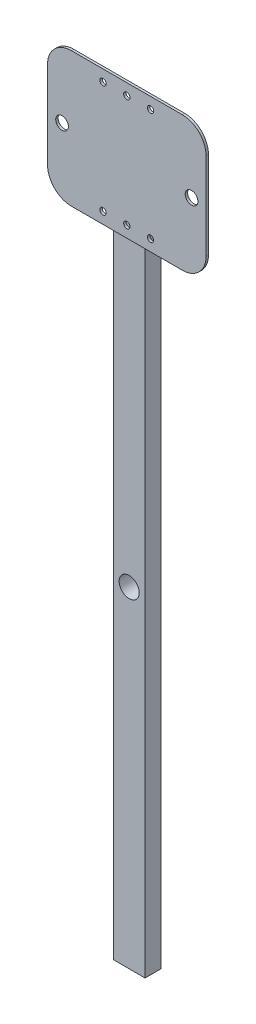
ISO-10303-21;
HEADER;
FILE_DESCRIPTION(('STEP AP214'),'2;1');
FILE_NAME('part.step','',(''),(''),'','','');
FILE_SCHEMA(('AUTOMOTIVE_DESIGN { 1 0 10303 214 1 1 1 1 }'));
ENDSEC;
DATA;
#1=APPLICATION_CONTEXT('core data for automotive mechanical design processes');
#2=APPLICATION_PROTOCOL_DEFINITION('international standard','automotive_design',2000,#1);
#3=PRODUCT_CONTEXT('',#1,'mechanical');
#4=PRODUCT('Part','Part','',(#3));
#5=PRODUCT_RELATED_PRODUCT_CATEGORY('part','',(#4));
#6=PRODUCT_DEFINITION_FORMATION('','',#4);
#7=PRODUCT_DEFINITION_CONTEXT('part definition',#1,'design');
#8=PRODUCT_DEFINITION('design','',#6,#7);
#9=PRODUCT_DEFINITION_SHAPE('','',#8);
#10=(LENGTH_UNIT() NAMED_UNIT(*) SI_UNIT(.MILLI.,.METRE.));
#11=(NAMED_UNIT(*) PLANE_ANGLE_UNIT() SI_UNIT($,.RADIAN.));
#12=(NAMED_UNIT(*) SI_UNIT($,.STERADIAN.) SOLID_ANGLE_UNIT());
#13=UNCERTAINTY_MEASURE_WITH_UNIT(LENGTH_MEASURE(1.E-05),#10,'distance_accuracy_value','');
#14=(GEOMETRIC_REPRESENTATION_CONTEXT(3) GLOBAL_UNCERTAINTY_ASSIGNED_CONTEXT((#13)) GLOBAL_UNIT_ASSIGNED_CONTEXT((#10,
#11,#12)) REPRESENTATION_CONTEXT('',''));
#15=CARTESIAN_POINT('',(0.,0.,0.));
#16=DIRECTION('',(0.,0.,1.));
#17=DIRECTION('',(1.,0.,0.));
#18=AXIS2_PLACEMENT_3D('',#15,#16,#17);
#19=CARTESIAN_POINT('',(-70.,-55.,3.));
#20=DIRECTION('',(0.,0.,1.));
#21=DIRECTION('',(1.,0.,0.));
#22=AXIS2_PLACEMENT_3D('',#19,#20,#21);
#23=PLANE('',#22);
#24=CARTESIAN_POINT('',(-30.,-70.6,3.));
#25=DIRECTION('',(0.,0.,1.));
#26=DIRECTION('',(1.,0.,0.));
#27=AXIS2_PLACEMENT_3D('',#24,#25,#26);
#28=CIRCLE('',#27,4.);
#29=CARTESIAN_POINT('',(-26.,-70.6,3.));
#30=VERTEX_POINT('',#29);
#31=EDGE_CURVE('E225',#30,#30,#28,.T.);
#32=ORIENTED_EDGE('',*,*,#31,.F.);
#33=EDGE_LOOP('',(#32));
#34=FACE_BOUND('',#33,.T.);
#35=CARTESIAN_POINT('',(-30.,70.6,3.));
#36=DIRECTION('',(0.,0.,1.));
#37=DIRECTION('',(1.,0.,0.));
#38=AXIS2_PLACEMENT_3D('',#35,#36,#37);
#39=CIRCLE('',#38,4.);
#40=CARTESIAN_POINT('',(-26.,70.6,3.));
#41=VERTEX_POINT('',#40);
#42=EDGE_CURVE('E237',#41,#41,#39,.T.);
#43=ORIENTED_EDGE('',*,*,#42,.F.);
#44=EDGE_LOOP('',(#43));
#45=FACE_BOUND('',#44,.T.);
#46=CARTESIAN_POINT('',(0.,70.6,3.));
#47=DIRECTION('',(0.,0.,1.));
#48=DIRECTION('',(1.,0.,0.));
#49=AXIS2_PLACEMENT_3D('',#46,#47,#48);
#50=CIRCLE('',#49,4.);
#51=CARTESIAN_POINT('',(4.,70.6,3.));
#52=VERTEX_POINT('',#51);
#53=EDGE_CURVE('E249',#52,#52,#50,.T.);
#54=ORIENTED_EDGE('',*,*,#53,.F.);
#55=EDGE_LOOP('',(#54));
#56=FACE_BOUND('',#55,.T.);
#57=CARTESIAN_POINT('',(-81.705,0.,3.));
#58=DIRECTION('',(0.,0.,1.));
#59=DIRECTION('',(1.,0.,0.));
#60=AXIS2_PLACEMENT_3D('',#57,#58,#59);
#61=CIRCLE('',#60,8.);
#62=CARTESIAN_POINT('',(-73.705,0.,3.));
#63=VERTEX_POINT('',#62);
#64=EDGE_CURVE('E149',#63,#63,#61,.T.);
#65=ORIENTED_EDGE('',*,*,#64,.F.);
#66=EDGE_LOOP('',(#65));
#67=FACE_BOUND('',#66,.T.);
#68=CARTESIAN_POINT('',(-70.,-55.,3.));
#69=DIRECTION('',(0.,0.,1.));
#70=DIRECTION('',(1.,0.,0.));
#71=AXIS2_PLACEMENT_3D('',#68,#69,#70);
#72=CIRCLE('',#71,30.);
#73=CARTESIAN_POINT('',(-99.9999999999999,-54.9999999999998,3.));
#74=VERTEX_POINT('',#73);
#75=CARTESIAN_POINT('',(-69.9999999999997,-85.,3.));
#76=VERTEX_POINT('',#75);
#77=EDGE_CURVE('E164',#74,#76,#72,.T.);
#78=ORIENTED_EDGE('',*,*,#77,.T.);
#79=DIRECTION('',(1.,0.,0.));
#80=VECTOR('',#79,1.);
#81=CARTESIAN_POINT('',(69.9999999999998,-85.,3.));
#82=LINE('',#81,#80);
#83=CARTESIAN_POINT('',(69.9999999999998,-85.,3.));
#84=VERTEX_POINT('',#83);
#85=EDGE_CURVE('E102',#76,#84,#82,.T.);
#86=ORIENTED_EDGE('',*,*,#85,.T.);
#87=CARTESIAN_POINT('',(70.,-55.,3.));
#88=DIRECTION('',(0.,0.,1.));
#89=DIRECTION('',(1.,0.,0.));
#90=AXIS2_PLACEMENT_3D('',#87,#88,#89);
#91=CIRCLE('',#90,30.);
#92=CARTESIAN_POINT('',(100.,-54.9999999999998,3.));
#93=VERTEX_POINT('',#92);
#94=EDGE_CURVE('E267',#84,#93,#91,.T.);
#95=ORIENTED_EDGE('',*,*,#94,.T.);
#96=DIRECTION('',(0.,1.,0.));
#97=VECTOR('',#96,1.);
#98=CARTESIAN_POINT('',(100.,54.9999999999998,3.));
#99=LINE('',#98,#97);
#100=CARTESIAN_POINT('',(100.,54.9999999999998,3.));
#101=VERTEX_POINT('',#100);
#102=EDGE_CURVE('E269',#93,#101,#99,.T.);
#103=ORIENTED_EDGE('',*,*,#102,.T.);
#104=CARTESIAN_POINT('',(70.,55.,3.));
#105=DIRECTION('',(0.,0.,1.));
#106=DIRECTION('',(1.,0.,0.));
#107=AXIS2_PLACEMENT_3D('',#104,#105,#106);
#108=CIRCLE('',#107,30.);
#109=CARTESIAN_POINT('',(69.9999999999998,85.,3.));
#110=VERTEX_POINT('',#109);
#111=EDGE_CURVE('E124',#101,#110,#108,.T.);
#112=ORIENTED_EDGE('',*,*,#111,.T.);
#113=DIRECTION('',(-1.,0.,0.));
#114=VECTOR('',#113,1.);
#115=CARTESIAN_POINT('',(69.9999999999998,85.,3.));
#116=LINE('',#115,#114);
#117=CARTESIAN_POINT('',(-69.9999999999998,85.,3.));
#118=VERTEX_POINT('',#117);
#119=EDGE_CURVE('E117',#110,#118,#116,.T.);
#120=ORIENTED_EDGE('',*,*,#119,.T.);
#121=CARTESIAN_POINT('',(-70.,55.,3.));
#122=DIRECTION('',(0.,0.,1.));
#123=DIRECTION('',(1.,0.,0.));
#124=AXIS2_PLACEMENT_3D('',#121,#122,#123);
#125=CIRCLE('',#124,30.);
#126=CARTESIAN_POINT('',(-100.,54.9999999999998,3.));
#127=VERTEX_POINT('',#126);
#128=EDGE_CURVE('E121',#118,#127,#125,.T.);
#129=ORIENTED_EDGE('',*,*,#128,.T.);
#130=DIRECTION('',(0.,-1.,0.));
#131=VECTOR('',#130,1.);
#132=CARTESIAN_POINT('',(-100.,54.9999999999998,3.));
#133=LINE('',#132,#131);
#134=EDGE_CURVE('E60',#127,#74,#133,.T.);
#135=ORIENTED_EDGE('',*,*,#134,.T.);
#136=EDGE_LOOP('',(#78,#86,#95,#103,#112,#120,#129,#135));
#137=FACE_BOUND('',#136,.T.);
#138=CARTESIAN_POINT('',(81.705,0.,3.));
#139=DIRECTION('',(0.,0.,1.));
#140=DIRECTION('',(1.,0.,0.));
#141=AXIS2_PLACEMENT_3D('',#138,#139,#140);
#142=CIRCLE('',#141,8.);
#143=CARTESIAN_POINT('',(89.705,0.,3.));
#144=VERTEX_POINT('',#143);
#145=EDGE_CURVE('E255',#144,#144,#142,.T.);
#146=ORIENTED_EDGE('',*,*,#145,.F.);
#147=EDGE_LOOP('',(#146));
#148=FACE_BOUND('',#147,.T.);
#149=CARTESIAN_POINT('',(0.,-70.6,3.));
#150=DIRECTION('',(0.,0.,1.));
#151=DIRECTION('',(1.,0.,0.));
#152=AXIS2_PLACEMENT_3D('',#149,#150,#151);
#153=CIRCLE('',#152,4.);
#154=CARTESIAN_POINT('',(4.,-70.6,3.));
#155=VERTEX_POINT('',#154);
#156=EDGE_CURVE('E243',#155,#155,#153,.T.);
#157=ORIENTED_EDGE('',*,*,#156,.F.);
#158=EDGE_LOOP('',(#157));
#159=FACE_BOUND('',#158,.T.);
#160=CARTESIAN_POINT('',(30.,70.6,3.));
#161=DIRECTION('',(0.,0.,1.));
#162=DIRECTION('',(1.,0.,0.));
#163=AXIS2_PLACEMENT_3D('',#160,#161,#162);
#164=CIRCLE('',#163,4.);
#165=CARTESIAN_POINT('',(34.,70.6,3.));
#166=VERTEX_POINT('',#165);
#167=EDGE_CURVE('E231',#166,#166,#164,.T.);
#168=ORIENTED_EDGE('',*,*,#167,.F.);
#169=EDGE_LOOP('',(#168));
#170=FACE_BOUND('',#169,.T.);
#171=CARTESIAN_POINT('',(30.,-70.6,3.));
#172=DIRECTION('',(0.,0.,1.));
#173=DIRECTION('',(1.,0.,0.));
#174=AXIS2_PLACEMENT_3D('',#171,#172,#173);
#175=CIRCLE('',#174,4.);
#176=CARTESIAN_POINT('',(34.,-70.6,3.));
#177=VERTEX_POINT('',#176);
#178=EDGE_CURVE('E219',#177,#177,#175,.T.);
#179=ORIENTED_EDGE('',*,*,#178,.F.);
#180=EDGE_LOOP('',(#179));
#181=FACE_BOUND('',#180,.T.);
#182=ADVANCED_FACE('F34',(#34,#45,#56,#67,#137,#148,#159,#170,#181),#23,.T.);
#183=CARTESIAN_POINT('',(-70.,-55.,0.));
#184=DIRECTION('',(0.,0.,1.));
#185=DIRECTION('',(1.,0.,0.));
#186=AXIS2_PLACEMENT_3D('',#183,#184,#185);
#187=PLANE('',#186);
#188=DIRECTION('',(-1.,0.,0.));
#189=VECTOR('',#188,1.);
#190=CARTESIAN_POINT('',(-20.,0.,0.));
#191=LINE('',#190,#189);
#192=CARTESIAN_POINT('',(20.,0.,0.));
#193=VERTEX_POINT('',#192);
#194=CARTESIAN_POINT('',(-20.,0.,0.));
#195=VERTEX_POINT('',#194);
#196=EDGE_CURVE('E190',#193,#195,#191,.T.);
#197=ORIENTED_EDGE('',*,*,#196,.T.);
#198=DIRECTION('',(0.,-1.,0.));
#199=VECTOR('',#198,1.);
#200=CARTESIAN_POINT('',(-20.,0.,0.));
#201=LINE('',#200,#199);
#202=CARTESIAN_POINT('',(-20.,-85.,0.));
#203=VERTEX_POINT('',#202);
#204=EDGE_CURVE('E51',#195,#203,#201,.T.);
#205=ORIENTED_EDGE('',*,*,#204,.T.);
#206=DIRECTION('',(1.,0.,0.));
#207=VECTOR('',#206,1.);
#208=CARTESIAN_POINT('',(69.9999999999998,-85.,0.));
#209=LINE('',#208,#207);
#210=CARTESIAN_POINT('',(-69.9999999999997,-85.,0.));
#211=VERTEX_POINT('',#210);
#212=EDGE_CURVE('E150',#211,#203,#209,.T.);
#213=ORIENTED_EDGE('',*,*,#212,.F.);
#214=CARTESIAN_POINT('',(-70.,-55.,0.));
#215=DIRECTION('',(0.,0.,1.));
#216=DIRECTION('',(1.,0.,0.));
#217=AXIS2_PLACEMENT_3D('',#214,#215,#216);
#218=CIRCLE('',#217,30.);
#219=CARTESIAN_POINT('',(-99.9999999999999,-54.9999999999998,0.));
#220=VERTEX_POINT('',#219);
#221=EDGE_CURVE('E145',#220,#211,#218,.T.);
#222=ORIENTED_EDGE('',*,*,#221,.F.);
#223=DIRECTION('',(0.,-1.,0.));
#224=VECTOR('',#223,1.);
#225=CARTESIAN_POINT('',(-100.,54.9999999999998,0.));
#226=LINE('',#225,#224);
#227=CARTESIAN_POINT('',(-100.,54.9999999999998,0.));
#228=VERTEX_POINT('',#227);
#229=EDGE_CURVE('E93',#228,#220,#226,.T.);
#230=ORIENTED_EDGE('',*,*,#229,.F.);
#231=CARTESIAN_POINT('',(-70.,55.,0.));
#232=DIRECTION('',(0.,0.,1.));
#233=DIRECTION('',(1.,0.,0.));
#234=AXIS2_PLACEMENT_3D('',#231,#232,#233);
#235=CIRCLE('',#234,30.);
#236=CARTESIAN_POINT('',(-69.9999999999998,85.,0.));
#237=VERTEX_POINT('',#236);
#238=EDGE_CURVE('E161',#237,#228,#235,.T.);
#239=ORIENTED_EDGE('',*,*,#238,.F.);
#240=DIRECTION('',(-1.,0.,0.));
#241=VECTOR('',#240,1.);
#242=CARTESIAN_POINT('',(69.9999999999998,85.,0.));
#243=LINE('',#242,#241);
#244=CARTESIAN_POINT('',(69.9999999999998,85.,0.));
#245=VERTEX_POINT('',#244);
#246=EDGE_CURVE('E133',#245,#237,#243,.T.);
#247=ORIENTED_EDGE('',*,*,#246,.F.);
#248=CARTESIAN_POINT('',(70.,55.,0.));
#249=DIRECTION('',(0.,0.,1.));
#250=DIRECTION('',(1.,0.,0.));
#251=AXIS2_PLACEMENT_3D('',#248,#249,#250);
#252=CIRCLE('',#251,30.);
#253=CARTESIAN_POINT('',(100.,54.9999999999998,0.));
#254=VERTEX_POINT('',#253);
#255=EDGE_CURVE('E158',#254,#245,#252,.T.);
#256=ORIENTED_EDGE('',*,*,#255,.F.);
#257=DIRECTION('',(0.,1.,0.));
#258=VECTOR('',#257,1.);
#259=CARTESIAN_POINT('',(100.,54.9999999999998,0.));
#260=LINE('',#259,#258);
#261=CARTESIAN_POINT('',(100.,-54.9999999999998,0.));
#262=VERTEX_POINT('',#261);
#263=EDGE_CURVE('E156',#262,#254,#260,.T.);
#264=ORIENTED_EDGE('',*,*,#263,.F.);
#265=CARTESIAN_POINT('',(70.,-55.,0.));
#266=DIRECTION('',(0.,0.,1.));
#267=DIRECTION('',(1.,0.,0.));
#268=AXIS2_PLACEMENT_3D('',#265,#266,#267);
#269=CIRCLE('',#268,30.);
#270=CARTESIAN_POINT('',(69.9999999999998,-85.,0.));
#271=VERTEX_POINT('',#270);
#272=EDGE_CURVE('E153',#271,#262,#269,.T.);
#273=ORIENTED_EDGE('',*,*,#272,.F.);
#274=CARTESIAN_POINT('',(20.,-85.,0.));
#275=VERTEX_POINT('',#274);
#276=EDGE_CURVE('E148',#275,#271,#209,.T.);
#277=ORIENTED_EDGE('',*,*,#276,.F.);
#278=DIRECTION('',(0.,1.,0.));
#279=VECTOR('',#278,1.);
#280=CARTESIAN_POINT('',(20.,0.,0.));
#281=LINE('',#280,#279);
#282=EDGE_CURVE('E11',#275,#193,#281,.T.);
#283=ORIENTED_EDGE('',*,*,#282,.T.);
#284=EDGE_LOOP('',(#197,#205,#213,#222,#230,#239,#247,#256,#264,#273,#277,#283));
#285=FACE_BOUND('',#284,.T.);
#286=CARTESIAN_POINT('',(-81.705,0.,0.));
#287=DIRECTION('',(0.,0.,1.));
#288=DIRECTION('',(1.,0.,0.));
#289=AXIS2_PLACEMENT_3D('',#286,#287,#288);
#290=CIRCLE('',#289,8.);
#291=CARTESIAN_POINT('',(-73.705,0.,0.));
#292=VERTEX_POINT('',#291);
#293=EDGE_CURVE('E258',#292,#292,#290,.T.);
#294=ORIENTED_EDGE('',*,*,#293,.T.);
#295=EDGE_LOOP('',(#294));
#296=FACE_BOUND('',#295,.T.);
#297=CARTESIAN_POINT('',(81.705,0.,0.));
#298=DIRECTION('',(0.,0.,1.));
#299=DIRECTION('',(1.,0.,0.));
#300=AXIS2_PLACEMENT_3D('',#297,#298,#299);
#301=CIRCLE('',#300,8.);
#302=CARTESIAN_POINT('',(89.705,0.,0.));
#303=VERTEX_POINT('',#302);
#304=EDGE_CURVE('E252',#303,#303,#301,.T.);
#305=ORIENTED_EDGE('',*,*,#304,.T.);
#306=EDGE_LOOP('',(#305));
#307=FACE_BOUND('',#306,.T.);
#308=CARTESIAN_POINT('',(0.,70.6,0.));
#309=DIRECTION('',(0.,0.,1.));
#310=DIRECTION('',(1.,0.,0.));
#311=AXIS2_PLACEMENT_3D('',#308,#309,#310);
#312=CIRCLE('',#311,4.);
#313=CARTESIAN_POINT('',(4.,70.6,0.));
#314=VERTEX_POINT('',#313);
#315=EDGE_CURVE('E246',#314,#314,#312,.T.);
#316=ORIENTED_EDGE('',*,*,#315,.T.);
#317=EDGE_LOOP('',(#316));
#318=FACE_BOUND('',#317,.T.);
#319=CARTESIAN_POINT('',(-30.,70.6,0.));
#320=DIRECTION('',(0.,0.,1.));
#321=DIRECTION('',(1.,0.,0.));
#322=AXIS2_PLACEMENT_3D('',#319,#320,#321);
#323=CIRCLE('',#322,4.);
#324=CARTESIAN_POINT('',(-26.,70.6,0.));
#325=VERTEX_POINT('',#324);
#326=EDGE_CURVE('E234',#325,#325,#323,.T.);
#327=ORIENTED_EDGE('',*,*,#326,.T.);
#328=EDGE_LOOP('',(#327));
#329=FACE_BOUND('',#328,.T.);
#330=CARTESIAN_POINT('',(30.,70.6,0.));
#331=DIRECTION('',(0.,0.,1.));
#332=DIRECTION('',(1.,0.,0.));
#333=AXIS2_PLACEMENT_3D('',#330,#331,#332);
#334=CIRCLE('',#333,4.);
#335=CARTESIAN_POINT('',(34.,70.6,0.));
#336=VERTEX_POINT('',#335);
#337=EDGE_CURVE('E228',#336,#336,#334,.T.);
#338=ORIENTED_EDGE('',*,*,#337,.T.);
#339=EDGE_LOOP('',(#338));
#340=FACE_BOUND('',#339,.T.);
#341=CARTESIAN_POINT('',(-30.,-70.6,0.));
#342=DIRECTION('',(0.,0.,1.));
#343=DIRECTION('',(1.,0.,0.));
#344=AXIS2_PLACEMENT_3D('',#341,#342,#343);
#345=CIRCLE('',#344,4.);
#346=CARTESIAN_POINT('',(-26.,-70.6,0.));
#347=VERTEX_POINT('',#346);
#348=EDGE_CURVE('E222',#347,#347,#345,.T.);
#349=ORIENTED_EDGE('',*,*,#348,.T.);
#350=EDGE_LOOP('',(#349));
#351=FACE_BOUND('',#350,.T.);
#352=CARTESIAN_POINT('',(30.,-70.6,0.));
#353=DIRECTION('',(0.,0.,1.));
#354=DIRECTION('',(1.,0.,0.));
#355=AXIS2_PLACEMENT_3D('',#352,#353,#354);
#356=CIRCLE('',#355,4.);
#357=CARTESIAN_POINT('',(34.,-70.6,0.));
#358=VERTEX_POINT('',#357);
#359=EDGE_CURVE('E209',#358,#358,#356,.T.);
#360=ORIENTED_EDGE('',*,*,#359,.T.);
#361=EDGE_LOOP('',(#360));
#362=FACE_BOUND('',#361,.T.);
#363=ADVANCED_FACE('F187',(#285,#296,#307,#318,#329,#340,#351,#362),#187,.F.);
#364=CARTESIAN_POINT('',(-70.,-55.,3.));
#365=DIRECTION('',(0.,0.,-1.));
#366=DIRECTION('',(-1.,0.,0.));
#367=AXIS2_PLACEMENT_3D('',#364,#365,#366);
#368=CYLINDRICAL_SURFACE('',#367,30.);
#369=ORIENTED_EDGE('',*,*,#221,.T.);
#370=DIRECTION('',(0.,0.,-1.));
#371=VECTOR('',#370,1.);
#372=CARTESIAN_POINT('',(-69.9999999999997,-85.,3.));
#373=LINE('',#372,#371);
#374=EDGE_CURVE('E38',#76,#211,#373,.T.);
#375=ORIENTED_EDGE('',*,*,#374,.F.);
#376=ORIENTED_EDGE('',*,*,#77,.F.);
#377=DIRECTION('',(0.,0.,-1.));
#378=VECTOR('',#377,1.);
#379=CARTESIAN_POINT('',(-99.9999999999999,-54.9999999999998,3.));
#380=LINE('',#379,#378);
#381=EDGE_CURVE('E141',#74,#220,#380,.T.);
#382=ORIENTED_EDGE('',*,*,#381,.T.);
#383=EDGE_LOOP('',(#369,#375,#376,#382));
#384=FACE_BOUND('',#383,.T.);
#385=ADVANCED_FACE('F36',(#384),#368,.T.);
#386=CARTESIAN_POINT('',(69.9999999999998,-85.,3.));
#387=DIRECTION('',(0.,1.,0.));
#388=DIRECTION('',(-1.,0.,0.));
#389=AXIS2_PLACEMENT_3D('',#386,#387,#388);
#390=PLANE('',#389);
#391=ORIENTED_EDGE('',*,*,#212,.T.);
#392=EDGE_CURVE('E154',#203,#275,#209,.T.);
#393=ORIENTED_EDGE('',*,*,#392,.T.);
#394=ORIENTED_EDGE('',*,*,#276,.T.);
#395=DIRECTION('',(0.,0.,-1.));
#396=VECTOR('',#395,1.);
#397=CARTESIAN_POINT('',(69.9999999999998,-85.,3.));
#398=LINE('',#397,#396);
#399=EDGE_CURVE('E173',#84,#271,#398,.T.);
#400=ORIENTED_EDGE('',*,*,#399,.F.);
#401=ORIENTED_EDGE('',*,*,#85,.F.);
#402=ORIENTED_EDGE('',*,*,#374,.T.);
#403=EDGE_LOOP('',(#391,#393,#394,#400,#401,#402));
#404=FACE_BOUND('',#403,.T.);
#405=ADVANCED_FACE('F179',(#404),#390,.F.);
#406=CARTESIAN_POINT('',(70.,-55.,3.));
#407=DIRECTION('',(0.,0.,-1.));
#408=DIRECTION('',(-1.,0.,0.));
#409=AXIS2_PLACEMENT_3D('',#406,#407,#408);
#410=CYLINDRICAL_SURFACE('',#409,30.);
#411=ORIENTED_EDGE('',*,*,#272,.T.);
#412=DIRECTION('',(0.,0.,-1.));
#413=VECTOR('',#412,1.);
#414=CARTESIAN_POINT('',(100.,-54.9999999999998,3.));
#415=LINE('',#414,#413);
#416=EDGE_CURVE('E171',#93,#262,#415,.T.);
#417=ORIENTED_EDGE('',*,*,#416,.F.);
#418=ORIENTED_EDGE('',*,*,#94,.F.);
#419=ORIENTED_EDGE('',*,*,#399,.T.);
#420=EDGE_LOOP('',(#411,#417,#418,#419));
#421=FACE_BOUND('',#420,.T.);
#422=ADVANCED_FACE('F281',(#421),#410,.T.);
#423=CARTESIAN_POINT('',(100.,54.9999999999998,3.));
#424=DIRECTION('',(-1.,0.,0.));
#425=DIRECTION('',(0.,-1.,0.));
#426=AXIS2_PLACEMENT_3D('',#423,#424,#425);
#427=PLANE('',#426);
#428=ORIENTED_EDGE('',*,*,#263,.T.);
#429=DIRECTION('',(0.,0.,-1.));
#430=VECTOR('',#429,1.);
#431=CARTESIAN_POINT('',(100.,54.9999999999998,3.));
#432=LINE('',#431,#430);
#433=EDGE_CURVE('E168',#101,#254,#432,.T.);
#434=ORIENTED_EDGE('',*,*,#433,.F.);
#435=ORIENTED_EDGE('',*,*,#102,.F.);
#436=ORIENTED_EDGE('',*,*,#416,.T.);
#437=EDGE_LOOP('',(#428,#434,#435,#436));
#438=FACE_BOUND('',#437,.T.);
#439=ADVANCED_FACE('F274',(#438),#427,.F.);
#440=CARTESIAN_POINT('',(70.,55.,3.));
#441=DIRECTION('',(0.,0.,-1.));
#442=DIRECTION('',(-1.,0.,0.));
#443=AXIS2_PLACEMENT_3D('',#440,#441,#442);
#444=CYLINDRICAL_SURFACE('',#443,30.);
#445=ORIENTED_EDGE('',*,*,#255,.T.);
#446=DIRECTION('',(0.,0.,-1.));
#447=VECTOR('',#446,1.);
#448=CARTESIAN_POINT('',(69.9999999999998,85.,3.));
#449=LINE('',#448,#447);
#450=EDGE_CURVE('E136',#110,#245,#449,.T.);
#451=ORIENTED_EDGE('',*,*,#450,.F.);
#452=ORIENTED_EDGE('',*,*,#111,.F.);
#453=ORIENTED_EDGE('',*,*,#433,.T.);
#454=EDGE_LOOP('',(#445,#451,#452,#453));
#455=FACE_BOUND('',#454,.T.);
#456=ADVANCED_FACE('F278',(#455),#444,.T.);
#457=CARTESIAN_POINT('',(69.9999999999998,85.,3.));
#458=DIRECTION('',(0.,-1.,0.));
#459=DIRECTION('',(1.,0.,0.));
#460=AXIS2_PLACEMENT_3D('',#457,#458,#459);
#461=PLANE('',#460);
#462=ORIENTED_EDGE('',*,*,#246,.T.);
#463=DIRECTION('',(0.,0.,-1.));
#464=VECTOR('',#463,1.);
#465=CARTESIAN_POINT('',(-69.9999999999998,85.,3.));
#466=LINE('',#465,#464);
#467=EDGE_CURVE('E130',#118,#237,#466,.T.);
#468=ORIENTED_EDGE('',*,*,#467,.F.);
#469=ORIENTED_EDGE('',*,*,#119,.F.);
#470=ORIENTED_EDGE('',*,*,#450,.T.);
#471=EDGE_LOOP('',(#462,#468,#469,#470));
#472=FACE_BOUND('',#471,.T.);
#473=ADVANCED_FACE('F131',(#472),#461,.F.);
#474=CARTESIAN_POINT('',(-70.,55.,3.));
#475=DIRECTION('',(0.,0.,-1.));
#476=DIRECTION('',(-1.,0.,0.));
#477=AXIS2_PLACEMENT_3D('',#474,#475,#476);
#478=CYLINDRICAL_SURFACE('',#477,30.);
#479=ORIENTED_EDGE('',*,*,#238,.T.);
#480=DIRECTION('',(0.,0.,-1.));
#481=VECTOR('',#480,1.);
#482=CARTESIAN_POINT('',(-100.,54.9999999999998,3.));
#483=LINE('',#482,#481);
#484=EDGE_CURVE('E137',#127,#228,#483,.T.);
#485=ORIENTED_EDGE('',*,*,#484,.F.);
#486=ORIENTED_EDGE('',*,*,#128,.F.);
#487=ORIENTED_EDGE('',*,*,#467,.T.);
#488=EDGE_LOOP('',(#479,#485,#486,#487));
#489=FACE_BOUND('',#488,.T.);
#490=ADVANCED_FACE('F139',(#489),#478,.T.);
#491=CARTESIAN_POINT('',(-100.,54.9999999999998,3.));
#492=DIRECTION('',(1.,0.,0.));
#493=DIRECTION('',(0.,1.,0.));
#494=AXIS2_PLACEMENT_3D('',#491,#492,#493);
#495=PLANE('',#494);
#496=ORIENTED_EDGE('',*,*,#229,.T.);
#497=ORIENTED_EDGE('',*,*,#381,.F.);
#498=ORIENTED_EDGE('',*,*,#134,.F.);
#499=ORIENTED_EDGE('',*,*,#484,.T.);
#500=EDGE_LOOP('',(#496,#497,#498,#499));
#501=FACE_BOUND('',#500,.T.);
#502=ADVANCED_FACE('F279',(#501),#495,.F.);
#503=CARTESIAN_POINT('',(-81.705,0.,3.));
#504=DIRECTION('',(0.,0.,-1.));
#505=DIRECTION('',(-1.,0.,0.));
#506=AXIS2_PLACEMENT_3D('',#503,#504,#505);
#507=CYLINDRICAL_SURFACE('',#506,8.);
#508=ORIENTED_EDGE('',*,*,#64,.T.);
#509=EDGE_LOOP('',(#508));
#510=FACE_BOUND('',#509,.T.);
#511=ORIENTED_EDGE('',*,*,#293,.F.);
#512=EDGE_LOOP('',(#511));
#513=FACE_BOUND('',#512,.T.);
#514=ADVANCED_FACE('F359',(#510,#513),#507,.F.);
#515=CARTESIAN_POINT('',(81.705,0.,3.));
#516=DIRECTION('',(0.,0.,-1.));
#517=DIRECTION('',(-1.,0.,0.));
#518=AXIS2_PLACEMENT_3D('',#515,#516,#517);
#519=CYLINDRICAL_SURFACE('',#518,8.);
#520=ORIENTED_EDGE('',*,*,#145,.T.);
#521=EDGE_LOOP('',(#520));
#522=FACE_BOUND('',#521,.T.);
#523=ORIENTED_EDGE('',*,*,#304,.F.);
#524=EDGE_LOOP('',(#523));
#525=FACE_BOUND('',#524,.T.);
#526=ADVANCED_FACE('F505',(#522,#525),#519,.F.);
#527=CARTESIAN_POINT('',(0.,70.6,3.));
#528=DIRECTION('',(0.,0.,-1.));
#529=DIRECTION('',(-1.,0.,0.));
#530=AXIS2_PLACEMENT_3D('',#527,#528,#529);
#531=CYLINDRICAL_SURFACE('',#530,4.);
#532=ORIENTED_EDGE('',*,*,#53,.T.);
#533=EDGE_LOOP('',(#532));
#534=FACE_BOUND('',#533,.T.);
#535=ORIENTED_EDGE('',*,*,#315,.F.);
#536=EDGE_LOOP('',(#535));
#537=FACE_BOUND('',#536,.T.);
#538=ADVANCED_FACE('F497',(#534,#537),#531,.F.);
#539=CARTESIAN_POINT('',(0.,-70.6,3.));
#540=DIRECTION('',(0.,0.,-1.));
#541=DIRECTION('',(-1.,0.,0.));
#542=AXIS2_PLACEMENT_3D('',#539,#540,#541);
#543=CYLINDRICAL_SURFACE('',#542,4.);
#544=ORIENTED_EDGE('',*,*,#156,.T.);
#545=EDGE_LOOP('',(#544));
#546=FACE_BOUND('',#545,.T.);
#547=CARTESIAN_POINT('',(0.,-70.6,0.));
#548=DIRECTION('',(0.,0.,1.));
#549=DIRECTION('',(1.,0.,0.));
#550=AXIS2_PLACEMENT_3D('',#547,#548,#549);
#551=CIRCLE('',#550,4.);
#552=CARTESIAN_POINT('',(4.,-70.6,0.));
#553=VERTEX_POINT('',#552);
#554=EDGE_CURVE('E240',#553,#553,#551,.T.);
#555=ORIENTED_EDGE('',*,*,#554,.F.);
#556=EDGE_LOOP('',(#555));
#557=FACE_BOUND('',#556,.T.);
#558=ADVANCED_FACE('F489',(#546,#557),#543,.F.);
#559=CARTESIAN_POINT('',(-30.,70.6,3.));
#560=DIRECTION('',(0.,0.,-1.));
#561=DIRECTION('',(-1.,0.,0.));
#562=AXIS2_PLACEMENT_3D('',#559,#560,#561);
#563=CYLINDRICAL_SURFACE('',#562,4.);
#564=ORIENTED_EDGE('',*,*,#42,.T.);
#565=EDGE_LOOP('',(#564));
#566=FACE_BOUND('',#565,.T.);
#567=ORIENTED_EDGE('',*,*,#326,.F.);
#568=EDGE_LOOP('',(#567));
#569=FACE_BOUND('',#568,.T.);
#570=ADVANCED_FACE('F481',(#566,#569),#563,.F.);
#571=CARTESIAN_POINT('',(30.,70.6,3.));
#572=DIRECTION('',(0.,0.,-1.));
#573=DIRECTION('',(-1.,0.,0.));
#574=AXIS2_PLACEMENT_3D('',#571,#572,#573);
#575=CYLINDRICAL_SURFACE('',#574,4.);
#576=ORIENTED_EDGE('',*,*,#167,.T.);
#577=EDGE_LOOP('',(#576));
#578=FACE_BOUND('',#577,.T.);
#579=ORIENTED_EDGE('',*,*,#337,.F.);
#580=EDGE_LOOP('',(#579));
#581=FACE_BOUND('',#580,.T.);
#582=ADVANCED_FACE('F473',(#578,#581),#575,.F.);
#583=CARTESIAN_POINT('',(-30.,-70.6,3.));
#584=DIRECTION('',(0.,0.,-1.));
#585=DIRECTION('',(-1.,0.,0.));
#586=AXIS2_PLACEMENT_3D('',#583,#584,#585);
#587=CYLINDRICAL_SURFACE('',#586,4.);
#588=ORIENTED_EDGE('',*,*,#31,.T.);
#589=EDGE_LOOP('',(#588));
#590=FACE_BOUND('',#589,.T.);
#591=ORIENTED_EDGE('',*,*,#348,.F.);
#592=EDGE_LOOP('',(#591));
#593=FACE_BOUND('',#592,.T.);
#594=ADVANCED_FACE('F468',(#590,#593),#587,.F.);
#595=CARTESIAN_POINT('',(30.,-70.6,3.));
#596=DIRECTION('',(0.,0.,-1.));
#597=DIRECTION('',(-1.,0.,0.));
#598=AXIS2_PLACEMENT_3D('',#595,#596,#597);
#599=CYLINDRICAL_SURFACE('',#598,4.);
#600=ORIENTED_EDGE('',*,*,#178,.T.);
#601=EDGE_LOOP('',(#600));
#602=FACE_BOUND('',#601,.T.);
#603=ORIENTED_EDGE('',*,*,#359,.F.);
#604=EDGE_LOOP('',(#603));
#605=FACE_BOUND('',#604,.T.);
#606=ADVANCED_FACE('F333',(#602,#605),#599,.F.);
#607=CARTESIAN_POINT('',(0.,-467.75,-20.));
#608=DIRECTION('',(0.,0.,1.));
#609=DIRECTION('',(1.,0.,0.));
#610=AXIS2_PLACEMENT_3D('',#607,#608,#609);
#611=CYLINDRICAL_SURFACE('',#610,12.7);
#612=CARTESIAN_POINT('',(0.,-467.75,-20.));
#613=DIRECTION('',(0.,0.,1.));
#614=DIRECTION('',(1.,0.,0.));
#615=AXIS2_PLACEMENT_3D('',#612,#613,#614);
#616=CIRCLE('',#615,12.7);
#617=CARTESIAN_POINT('',(12.7,-467.75,-20.));
#618=VERTEX_POINT('',#617);
#619=EDGE_CURVE('E199',#618,#618,#616,.T.);
#620=ORIENTED_EDGE('',*,*,#619,.F.);
#621=EDGE_LOOP('',(#620));
#622=FACE_BOUND('',#621,.T.);
#623=CARTESIAN_POINT('',(0.,-467.75,0.));
#624=DIRECTION('',(0.,0.,1.));
#625=DIRECTION('',(1.,0.,0.));
#626=AXIS2_PLACEMENT_3D('',#623,#624,#625);
#627=CIRCLE('',#626,12.7);
#628=CARTESIAN_POINT('',(12.7,-467.75,0.));
#629=VERTEX_POINT('',#628);
#630=EDGE_CURVE('E323',#629,#629,#627,.T.);
#631=ORIENTED_EDGE('',*,*,#630,.T.);
#632=EDGE_LOOP('',(#631));
#633=FACE_BOUND('',#632,.T.);
#634=ADVANCED_FACE('F330',(#622,#633),#611,.F.);
#635=CARTESIAN_POINT('',(0.,0.,-20.));
#636=DIRECTION('',(0.,0.,1.));
#637=DIRECTION('',(1.,0.,0.));
#638=AXIS2_PLACEMENT_3D('',#635,#636,#637);
#639=PLANE('',#638);
#640=ORIENTED_EDGE('',*,*,#619,.T.);
#641=EDGE_LOOP('',(#640));
#642=FACE_BOUND('',#641,.T.);
#643=DIRECTION('',(0.,-1.,0.));
#644=VECTOR('',#643,1.);
#645=CARTESIAN_POINT('',(-20.,0.,-20.));
#646=LINE('',#645,#644);
#647=CARTESIAN_POINT('',(-20.,0.,-20.));
#648=VERTEX_POINT('',#647);
#649=CARTESIAN_POINT('',(-20.,-885.,-20.));
#650=VERTEX_POINT('',#649);
#651=EDGE_CURVE('E206',#648,#650,#646,.T.);
#652=ORIENTED_EDGE('',*,*,#651,.F.);
#653=DIRECTION('',(-1.,0.,0.));
#654=VECTOR('',#653,1.);
#655=CARTESIAN_POINT('',(-20.,0.,-20.));
#656=LINE('',#655,#654);
#657=CARTESIAN_POINT('',(20.,0.,-20.));
#658=VERTEX_POINT('',#657);
#659=EDGE_CURVE('E201',#658,#648,#656,.T.);
#660=ORIENTED_EDGE('',*,*,#659,.F.);
#661=DIRECTION('',(0.,1.,0.));
#662=VECTOR('',#661,1.);
#663=CARTESIAN_POINT('',(20.,0.,-20.));
#664=LINE('',#663,#662);
#665=CARTESIAN_POINT('',(20.,-885.,-20.));
#666=VERTEX_POINT('',#665);
#667=EDGE_CURVE('E314',#666,#658,#664,.T.);
#668=ORIENTED_EDGE('',*,*,#667,.F.);
#669=DIRECTION('',(1.,0.,0.));
#670=VECTOR('',#669,1.);
#671=CARTESIAN_POINT('',(-20.,-885.,-20.));
#672=LINE('',#671,#670);
#673=EDGE_CURVE('E318',#650,#666,#672,.T.);
#674=ORIENTED_EDGE('',*,*,#673,.F.);
#675=EDGE_LOOP('',(#652,#660,#668,#674));
#676=FACE_BOUND('',#675,.T.);
#677=ADVANCED_FACE('F317',(#642,#676),#639,.F.);
#678=CARTESIAN_POINT('',(-20.,-885.,-20.));
#679=DIRECTION('',(0.,-1.,0.));
#680=DIRECTION('',(0.,0.,-1.));
#681=AXIS2_PLACEMENT_3D('',#678,#679,#680);
#682=PLANE('',#681);
#683=DIRECTION('',(1.,0.,0.));
#684=VECTOR('',#683,1.);
#685=CARTESIAN_POINT('',(-20.,-885.,0.));
#686=LINE('',#685,#684);
#687=CARTESIAN_POINT('',(-20.,-885.,0.));
#688=VERTEX_POINT('',#687);
#689=CARTESIAN_POINT('',(20.,-885.,0.));
#690=VERTEX_POINT('',#689);
#691=EDGE_CURVE('E193',#688,#690,#686,.T.);
#692=ORIENTED_EDGE('',*,*,#691,.F.);
#693=DIRECTION('',(0.,0.,1.));
#694=VECTOR('',#693,1.);
#695=CARTESIAN_POINT('',(-20.,-885.,-20.));
#696=LINE('',#695,#694);
#697=EDGE_CURVE('E216',#650,#688,#696,.T.);
#698=ORIENTED_EDGE('',*,*,#697,.F.);
#699=ORIENTED_EDGE('',*,*,#673,.T.);
#700=DIRECTION('',(0.,0.,1.));
#701=VECTOR('',#700,1.);
#702=CARTESIAN_POINT('',(20.,-885.,-20.));
#703=LINE('',#702,#701);
#704=EDGE_CURVE('E213',#666,#690,#703,.T.);
#705=ORIENTED_EDGE('',*,*,#704,.T.);
#706=EDGE_LOOP('',(#692,#698,#699,#705));
#707=FACE_BOUND('',#706,.T.);
#708=ADVANCED_FACE('F299',(#707),#682,.T.);
#709=CARTESIAN_POINT('',(20.,0.,-20.));
#710=DIRECTION('',(1.,0.,0.));
#711=DIRECTION('',(0.,0.,-1.));
#712=AXIS2_PLACEMENT_3D('',#709,#710,#711);
#713=PLANE('',#712);
#714=EDGE_CURVE('E44',#690,#275,#281,.T.);
#715=ORIENTED_EDGE('',*,*,#714,.F.);
#716=ORIENTED_EDGE('',*,*,#704,.F.);
#717=ORIENTED_EDGE('',*,*,#667,.T.);
#718=DIRECTION('',(0.,0.,1.));
#719=VECTOR('',#718,1.);
#720=CARTESIAN_POINT('',(20.,0.,-20.));
#721=LINE('',#720,#719);
#722=EDGE_CURVE('E210',#658,#193,#721,.T.);
#723=ORIENTED_EDGE('',*,*,#722,.T.);
#724=ORIENTED_EDGE('',*,*,#282,.F.);
#725=EDGE_LOOP('',(#715,#716,#717,#723,#724));
#726=FACE_BOUND('',#725,.T.);
#727=ADVANCED_FACE('F313',(#726),#713,.T.);
#728=CARTESIAN_POINT('',(-20.,0.,-20.));
#729=DIRECTION('',(0.,1.,0.));
#730=DIRECTION('',(0.,0.,1.));
#731=AXIS2_PLACEMENT_3D('',#728,#729,#730);
#732=PLANE('',#731);
#733=ORIENTED_EDGE('',*,*,#196,.F.);
#734=ORIENTED_EDGE('',*,*,#722,.F.);
#735=ORIENTED_EDGE('',*,*,#659,.T.);
#736=DIRECTION('',(0.,0.,1.));
#737=VECTOR('',#736,1.);
#738=CARTESIAN_POINT('',(-20.,0.,-20.));
#739=LINE('',#738,#737);
#740=EDGE_CURVE('E207',#648,#195,#739,.T.);
#741=ORIENTED_EDGE('',*,*,#740,.T.);
#742=EDGE_LOOP('',(#733,#734,#735,#741));
#743=FACE_BOUND('',#742,.T.);
#744=ADVANCED_FACE('F345',(#743),#732,.T.);
#745=CARTESIAN_POINT('',(-20.,0.,-20.));
#746=DIRECTION('',(-1.,0.,0.));
#747=DIRECTION('',(0.,0.,1.));
#748=AXIS2_PLACEMENT_3D('',#745,#746,#747);
#749=PLANE('',#748);
#750=ORIENTED_EDGE('',*,*,#204,.F.);
#751=ORIENTED_EDGE('',*,*,#740,.F.);
#752=ORIENTED_EDGE('',*,*,#651,.T.);
#753=ORIENTED_EDGE('',*,*,#697,.T.);
#754=EDGE_CURVE('E194',#203,#688,#201,.T.);
#755=ORIENTED_EDGE('',*,*,#754,.F.);
#756=EDGE_LOOP('',(#750,#751,#752,#753,#755));
#757=FACE_BOUND('',#756,.T.);
#758=ADVANCED_FACE('F288',(#757),#749,.T.);
#759=CARTESIAN_POINT('',(0.,0.,0.));
#760=DIRECTION('',(0.,0.,1.));
#761=DIRECTION('',(1.,0.,0.));
#762=AXIS2_PLACEMENT_3D('',#759,#760,#761);
#763=PLANE('',#762);
#764=ORIENTED_EDGE('',*,*,#630,.F.);
#765=EDGE_LOOP('',(#764));
#766=FACE_BOUND('',#765,.T.);
#767=ORIENTED_EDGE('',*,*,#392,.F.);
#768=ORIENTED_EDGE('',*,*,#754,.T.);
#769=ORIENTED_EDGE('',*,*,#691,.T.);
#770=ORIENTED_EDGE('',*,*,#714,.T.);
#771=EDGE_LOOP('',(#767,#768,#769,#770));
#772=FACE_BOUND('',#771,.T.);
#773=ADVANCED_FACE('F285',(#766,#772),#763,.T.);
#774=ORIENTED_EDGE('',*,*,#554,.T.);
#775=EDGE_LOOP('',(#774));
#776=FACE_BOUND('',#775,.T.);
#777=ADVANCED_FACE('F338',(#776),#763,.T.);
#778=CLOSED_SHELL('',(#182,#363,#385,#405,#422,#439,#456,#473,#490,#502,#514,#526,#538,#558,
#570,#582,#594,#606,#634,#677,#708,#727,#744,#758,#773,#777));
#779=MANIFOLD_SOLID_BREP('B2',#778);
#780=ADVANCED_BREP_SHAPE_REPRESENTATION('',(#18,#779),#14);
#781=SHAPE_DEFINITION_REPRESENTATION(#9,#780);
ENDSEC;
END-ISO-10303-21;
